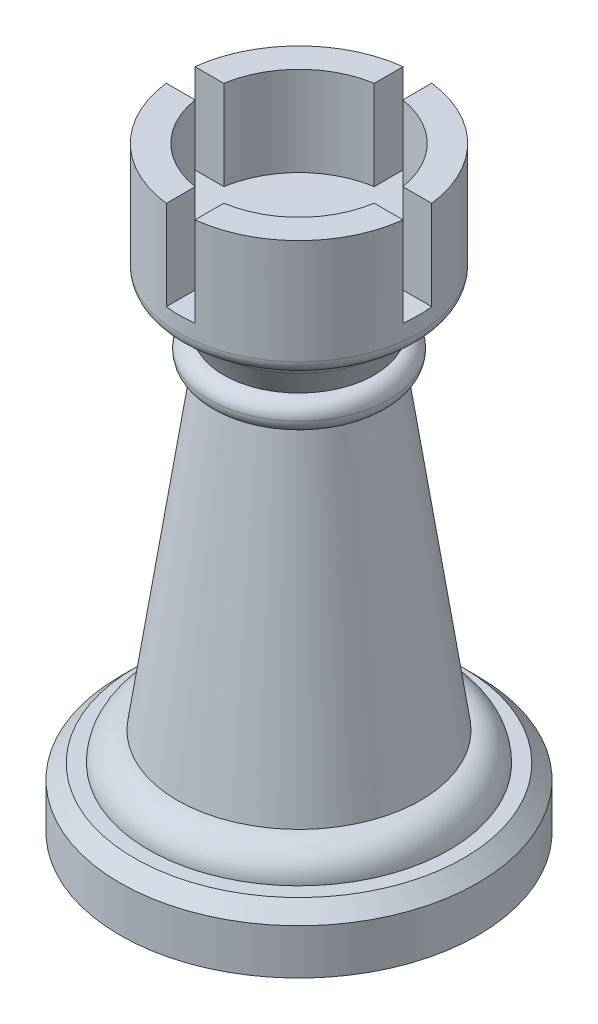
ISO-10303-21;
HEADER;
FILE_DESCRIPTION(('STEP AP214'),'2;1');
FILE_NAME('part.step','',(''),(''),'','','');
FILE_SCHEMA(('AUTOMOTIVE_DESIGN { 1 0 10303 214 1 1 1 1 }'));
ENDSEC;
DATA;
#1=APPLICATION_CONTEXT('core data for automotive mechanical design processes');
#2=APPLICATION_PROTOCOL_DEFINITION('international standard','automotive_design',2000,#1);
#3=PRODUCT_CONTEXT('',#1,'mechanical');
#4=PRODUCT('Part','Part','',(#3));
#5=PRODUCT_RELATED_PRODUCT_CATEGORY('part','',(#4));
#6=PRODUCT_DEFINITION_FORMATION('','',#4);
#7=PRODUCT_DEFINITION_CONTEXT('part definition',#1,'design');
#8=PRODUCT_DEFINITION('design','',#6,#7);
#9=PRODUCT_DEFINITION_SHAPE('','',#8);
#10=(LENGTH_UNIT() NAMED_UNIT(*) SI_UNIT(.MILLI.,.METRE.));
#11=(NAMED_UNIT(*) PLANE_ANGLE_UNIT() SI_UNIT($,.RADIAN.));
#12=(NAMED_UNIT(*) SI_UNIT($,.STERADIAN.) SOLID_ANGLE_UNIT());
#13=UNCERTAINTY_MEASURE_WITH_UNIT(LENGTH_MEASURE(1.E-05),#10,'distance_accuracy_value','');
#14=(GEOMETRIC_REPRESENTATION_CONTEXT(3) GLOBAL_UNCERTAINTY_ASSIGNED_CONTEXT((#13)) GLOBAL_UNIT_ASSIGNED_CONTEXT((#10,
#11,#12)) REPRESENTATION_CONTEXT('',''));
#15=CARTESIAN_POINT('',(0.,0.,0.));
#16=DIRECTION('',(0.,0.,1.));
#17=DIRECTION('',(1.,0.,0.));
#18=AXIS2_PLACEMENT_3D('',#15,#16,#17);
#19=CARTESIAN_POINT('',(0.,31.75,0.));
#20=DIRECTION('',(0.,-1.,0.));
#21=DIRECTION('',(0.,0.,-1.));
#22=AXIS2_PLACEMENT_3D('',#19,#20,#21);
#23=PLANE('',#22);
#24=DIRECTION('',(0.,0.,1.));
#25=VECTOR('',#24,1.);
#26=CARTESIAN_POINT('',(0.762,31.75,0.));
#27=LINE('',#26,#25);
#28=CARTESIAN_POINT('',(0.761999999999999,31.75,-6.30411421216335));
#29=VERTEX_POINT('',#28);
#30=CARTESIAN_POINT('',(0.761999999999999,31.75,-4.7654624119806));
#31=VERTEX_POINT('',#30);
#32=EDGE_CURVE('E203',#29,#31,#27,.T.);
#33=ORIENTED_EDGE('',*,*,#32,.T.);
#34=CARTESIAN_POINT('',(0.,31.75,0.));
#35=DIRECTION('',(0.,1.,0.));
#36=DIRECTION('',(0.,0.,1.));
#37=AXIS2_PLACEMENT_3D('',#34,#35,#36);
#38=CIRCLE('',#37,4.826);
#39=CARTESIAN_POINT('',(4.76546241198061,31.75,-0.761999999999984));
#40=VERTEX_POINT('',#39);
#41=EDGE_CURVE('E200',#40,#31,#38,.T.);
#42=ORIENTED_EDGE('',*,*,#41,.F.);
#43=DIRECTION('',(-1.,0.,0.));
#44=VECTOR('',#43,1.);
#45=CARTESIAN_POINT('',(0.,31.75,-0.762));
#46=LINE('',#45,#44);
#47=CARTESIAN_POINT('',(6.30411421216336,31.75,-0.761999999999979));
#48=VERTEX_POINT('',#47);
#49=EDGE_CURVE('E197',#48,#40,#46,.T.);
#50=ORIENTED_EDGE('',*,*,#49,.F.);
#51=CARTESIAN_POINT('',(0.,31.75,0.));
#52=DIRECTION('',(0.,-1.,0.));
#53=DIRECTION('',(0.,0.,-1.));
#54=AXIS2_PLACEMENT_3D('',#51,#52,#53);
#55=CIRCLE('',#54,6.35);
#56=EDGE_CURVE('E263',#29,#48,#55,.T.);
#57=ORIENTED_EDGE('',*,*,#56,.F.);
#58=EDGE_LOOP('',(#33,#42,#50,#57));
#59=FACE_BOUND('',#58,.T.);
#60=ADVANCED_FACE('F35',(#59),#23,.F.);
#61=DIRECTION('',(-1.,0.,0.));
#62=VECTOR('',#61,1.);
#63=CARTESIAN_POINT('',(0.,31.75,0.762));
#64=LINE('',#63,#62);
#65=CARTESIAN_POINT('',(6.30411421216335,31.75,0.762000000000021));
#66=VERTEX_POINT('',#65);
#67=CARTESIAN_POINT('',(4.7654624119806,31.75,0.762000000000016));
#68=VERTEX_POINT('',#67);
#69=EDGE_CURVE('E194',#66,#68,#64,.T.);
#70=ORIENTED_EDGE('',*,*,#69,.T.);
#71=CARTESIAN_POINT('',(0.,31.75,0.));
#72=DIRECTION('',(0.,1.,0.));
#73=DIRECTION('',(0.,0.,1.));
#74=AXIS2_PLACEMENT_3D('',#71,#72,#73);
#75=CIRCLE('',#74,4.826);
#76=CARTESIAN_POINT('',(0.762000000000001,31.75,4.7654624119806));
#77=VERTEX_POINT('',#76);
#78=EDGE_CURVE('E191',#77,#68,#75,.T.);
#79=ORIENTED_EDGE('',*,*,#78,.F.);
#80=DIRECTION('',(0.,0.,1.));
#81=VECTOR('',#80,1.);
#82=CARTESIAN_POINT('',(0.762,31.75,0.));
#83=LINE('',#82,#81);
#84=CARTESIAN_POINT('',(0.762000000000001,31.75,6.30411421216335));
#85=VERTEX_POINT('',#84);
#86=EDGE_CURVE('E188',#77,#85,#83,.T.);
#87=ORIENTED_EDGE('',*,*,#86,.T.);
#88=EDGE_CURVE('E266',#66,#85,#55,.T.);
#89=ORIENTED_EDGE('',*,*,#88,.F.);
#90=EDGE_LOOP('',(#70,#79,#87,#89));
#91=FACE_BOUND('',#90,.T.);
#92=ADVANCED_FACE('F303',(#91),#23,.F.);
#93=DIRECTION('',(-1.,0.,0.));
#94=VECTOR('',#93,1.);
#95=CARTESIAN_POINT('',(0.,31.75,0.762));
#96=LINE('',#95,#94);
#97=CARTESIAN_POINT('',(-4.76546241198061,31.75,0.761999999999984));
#98=VERTEX_POINT('',#97);
#99=CARTESIAN_POINT('',(-6.30411421216336,31.75,0.761999999999978));
#100=VERTEX_POINT('',#99);
#101=EDGE_CURVE('E213',#98,#100,#96,.T.);
#102=ORIENTED_EDGE('',*,*,#101,.T.);
#103=CARTESIAN_POINT('',(-0.761999999999999,31.75,6.30411421216335));
#104=VERTEX_POINT('',#103);
#105=EDGE_CURVE('E331',#104,#100,#55,.T.);
#106=ORIENTED_EDGE('',*,*,#105,.F.);
#107=DIRECTION('',(0.,0.,1.));
#108=VECTOR('',#107,1.);
#109=CARTESIAN_POINT('',(-0.762,31.75,0.));
#110=LINE('',#109,#108);
#111=CARTESIAN_POINT('',(-0.762,31.75,4.7654624119806));
#112=VERTEX_POINT('',#111);
#113=EDGE_CURVE('E186',#112,#104,#110,.T.);
#114=ORIENTED_EDGE('',*,*,#113,.F.);
#115=CARTESIAN_POINT('',(0.,31.75,0.));
#116=DIRECTION('',(0.,1.,0.));
#117=DIRECTION('',(0.,0.,1.));
#118=AXIS2_PLACEMENT_3D('',#115,#116,#117);
#119=CIRCLE('',#118,4.826);
#120=EDGE_CURVE('E184',#98,#112,#119,.T.);
#121=ORIENTED_EDGE('',*,*,#120,.F.);
#122=EDGE_LOOP('',(#102,#106,#114,#121));
#123=FACE_BOUND('',#122,.T.);
#124=ADVANCED_FACE('F310',(#123),#23,.F.);
#125=CARTESIAN_POINT('',(0.,0.,0.));
#126=DIRECTION('',(0.,-1.,0.));
#127=DIRECTION('',(0.,0.,-1.));
#128=AXIS2_PLACEMENT_3D('',#125,#126,#127);
#129=CYLINDRICAL_SURFACE('',#128,6.35);
#130=CARTESIAN_POINT('',(0.,26.162,0.));
#131=DIRECTION('',(0.,1.,0.));
#132=DIRECTION('',(0.,0.,1.));
#133=AXIS2_PLACEMENT_3D('',#130,#131,#132);
#134=CIRCLE('',#133,6.35);
#135=CARTESIAN_POINT('',(0.,26.162,6.35));
#136=VERTEX_POINT('',#135);
#137=EDGE_CURVE('E272',#136,#136,#134,.T.);
#138=ORIENTED_EDGE('',*,*,#137,.T.);
#139=EDGE_LOOP('',(#138));
#140=FACE_BOUND('',#139,.T.);
#141=ORIENTED_EDGE('',*,*,#56,.T.);
#142=DIRECTION('',(0.,1.,0.));
#143=VECTOR('',#142,1.);
#144=CARTESIAN_POINT('',(6.30411421216336,26.9875,-0.761999999999979));
#145=LINE('',#144,#143);
#146=CARTESIAN_POINT('',(6.30411421216336,26.9875,-0.761999999999979));
#147=VERTEX_POINT('',#146);
#148=EDGE_CURVE('E232',#147,#48,#145,.T.);
#149=ORIENTED_EDGE('',*,*,#148,.F.);
#150=CARTESIAN_POINT('',(0.,26.9875,0.));
#151=DIRECTION('',(0.,1.,0.));
#152=DIRECTION('',(0.,0.,1.));
#153=AXIS2_PLACEMENT_3D('',#150,#151,#152);
#154=CIRCLE('',#153,6.35);
#155=CARTESIAN_POINT('',(6.30411421216335,26.9875,0.762000000000021));
#156=VERTEX_POINT('',#155);
#157=EDGE_CURVE('E355',#156,#147,#154,.T.);
#158=ORIENTED_EDGE('',*,*,#157,.F.);
#159=DIRECTION('',(0.,1.,0.));
#160=VECTOR('',#159,1.);
#161=CARTESIAN_POINT('',(6.30411421216335,26.9875,0.762000000000021));
#162=LINE('',#161,#160);
#163=EDGE_CURVE('E234',#156,#66,#162,.T.);
#164=ORIENTED_EDGE('',*,*,#163,.T.);
#165=ORIENTED_EDGE('',*,*,#88,.T.);
#166=DIRECTION('',(0.,1.,0.));
#167=VECTOR('',#166,1.);
#168=CARTESIAN_POINT('',(0.762000000000001,26.9875,6.30411421216335));
#169=LINE('',#168,#167);
#170=CARTESIAN_POINT('',(0.762000000000001,26.9875,6.30411421216335));
#171=VERTEX_POINT('',#170);
#172=EDGE_CURVE('E241',#171,#85,#169,.T.);
#173=ORIENTED_EDGE('',*,*,#172,.F.);
#174=CARTESIAN_POINT('',(0.,26.9875,0.));
#175=DIRECTION('',(0.,1.,0.));
#176=DIRECTION('',(0.,0.,1.));
#177=AXIS2_PLACEMENT_3D('',#174,#175,#176);
#178=CIRCLE('',#177,6.35);
#179=CARTESIAN_POINT('',(-0.761999999999999,26.9875,6.30411421216335));
#180=VERTEX_POINT('',#179);
#181=EDGE_CURVE('E365',#180,#171,#178,.T.);
#182=ORIENTED_EDGE('',*,*,#181,.F.);
#183=DIRECTION('',(0.,1.,0.));
#184=VECTOR('',#183,1.);
#185=CARTESIAN_POINT('',(-0.761999999999999,26.9875,6.30411421216335));
#186=LINE('',#185,#184);
#187=EDGE_CURVE('E243',#180,#104,#186,.T.);
#188=ORIENTED_EDGE('',*,*,#187,.T.);
#189=ORIENTED_EDGE('',*,*,#105,.T.);
#190=DIRECTION('',(0.,1.,0.));
#191=VECTOR('',#190,1.);
#192=CARTESIAN_POINT('',(-6.30411421216336,26.9875,0.761999999999978));
#193=LINE('',#192,#191);
#194=CARTESIAN_POINT('',(-6.30411421216336,26.9875,0.761999999999978));
#195=VERTEX_POINT('',#194);
#196=EDGE_CURVE('E165',#195,#100,#193,.T.);
#197=ORIENTED_EDGE('',*,*,#196,.F.);
#198=CARTESIAN_POINT('',(0.,26.9875,0.));
#199=DIRECTION('',(0.,1.,0.));
#200=DIRECTION('',(0.,0.,1.));
#201=AXIS2_PLACEMENT_3D('',#198,#199,#200);
#202=CIRCLE('',#201,6.35);
#203=CARTESIAN_POINT('',(-6.30411421216335,26.9875,-0.762000000000021));
#204=VERTEX_POINT('',#203);
#205=EDGE_CURVE('E170',#204,#195,#202,.T.);
#206=ORIENTED_EDGE('',*,*,#205,.F.);
#207=DIRECTION('',(0.,1.,0.));
#208=VECTOR('',#207,1.);
#209=CARTESIAN_POINT('',(-6.30411421216335,26.9875,-0.762000000000021));
#210=LINE('',#209,#208);
#211=CARTESIAN_POINT('',(-6.30411421216335,31.75,-0.762000000000021));
#212=VERTEX_POINT('',#211);
#213=EDGE_CURVE('E154',#204,#212,#210,.T.);
#214=ORIENTED_EDGE('',*,*,#213,.T.);
#215=CARTESIAN_POINT('',(-0.762000000000001,31.75,-6.30411421216335));
#216=VERTEX_POINT('',#215);
#217=EDGE_CURVE('E262',#212,#216,#55,.T.);
#218=ORIENTED_EDGE('',*,*,#217,.T.);
#219=DIRECTION('',(0.,1.,0.));
#220=VECTOR('',#219,1.);
#221=CARTESIAN_POINT('',(-0.762000000000001,26.9875,-6.30411421216335));
#222=LINE('',#221,#220);
#223=CARTESIAN_POINT('',(-0.762000000000001,26.9875,-6.30411421216335));
#224=VERTEX_POINT('',#223);
#225=EDGE_CURVE('E223',#224,#216,#222,.T.);
#226=ORIENTED_EDGE('',*,*,#225,.F.);
#227=CARTESIAN_POINT('',(0.,26.9875,0.));
#228=DIRECTION('',(0.,1.,0.));
#229=DIRECTION('',(0.,0.,1.));
#230=AXIS2_PLACEMENT_3D('',#227,#228,#229);
#231=CIRCLE('',#230,6.35);
#232=CARTESIAN_POINT('',(0.761999999999999,26.9875,-6.30411421216335));
#233=VERTEX_POINT('',#232);
#234=EDGE_CURVE('E342',#233,#224,#231,.T.);
#235=ORIENTED_EDGE('',*,*,#234,.F.);
#236=DIRECTION('',(0.,1.,0.));
#237=VECTOR('',#236,1.);
#238=CARTESIAN_POINT('',(0.761999999999999,26.9875,-6.30411421216335));
#239=LINE('',#238,#237);
#240=EDGE_CURVE('E225',#233,#29,#239,.T.);
#241=ORIENTED_EDGE('',*,*,#240,.T.);
#242=EDGE_LOOP('',(#141,#149,#158,#164,#165,#173,#182,#188,#189,#197,#206,#214,#218,#226,#235,#241));
#243=FACE_BOUND('',#242,.T.);
#244=ADVANCED_FACE('F177',(#140,#243),#129,.T.);
#245=ORIENTED_EDGE('',*,*,#217,.F.);
#246=DIRECTION('',(-1.,0.,0.));
#247=VECTOR('',#246,1.);
#248=CARTESIAN_POINT('',(0.,31.75,-0.762));
#249=LINE('',#248,#247);
#250=CARTESIAN_POINT('',(-4.7654624119806,31.75,-0.762000000000016));
#251=VERTEX_POINT('',#250);
#252=EDGE_CURVE('E160',#251,#212,#249,.T.);
#253=ORIENTED_EDGE('',*,*,#252,.F.);
#254=CARTESIAN_POINT('',(0.,31.75,0.));
#255=DIRECTION('',(0.,1.,0.));
#256=DIRECTION('',(0.,0.,1.));
#257=AXIS2_PLACEMENT_3D('',#254,#255,#256);
#258=CIRCLE('',#257,4.826);
#259=CARTESIAN_POINT('',(-0.762000000000001,31.75,-4.7654624119806));
#260=VERTEX_POINT('',#259);
#261=EDGE_CURVE('E209',#260,#251,#258,.T.);
#262=ORIENTED_EDGE('',*,*,#261,.F.);
#263=DIRECTION('',(0.,0.,1.));
#264=VECTOR('',#263,1.);
#265=CARTESIAN_POINT('',(-0.762,31.75,0.));
#266=LINE('',#265,#264);
#267=EDGE_CURVE('E206',#216,#260,#266,.T.);
#268=ORIENTED_EDGE('',*,*,#267,.F.);
#269=EDGE_LOOP('',(#245,#253,#262,#268));
#270=FACE_BOUND('',#269,.T.);
#271=ADVANCED_FACE('F306',(#270),#23,.F.);
#272=CARTESIAN_POINT('',(0.,24.638,0.));
#273=DIRECTION('',(0.,1.,0.));
#274=DIRECTION('',(0.,0.,1.));
#275=AXIS2_PLACEMENT_3D('',#272,#273,#274);
#276=CONICAL_SURFACE('',#275,4.826,0.482814590584315);
#277=CARTESIAN_POINT('',(0.,24.50154623125,0.));
#278=DIRECTION('',(0.,-1.,0.));
#279=DIRECTION('',(0.,0.,-1.));
#280=AXIS2_PLACEMENT_3D('',#277,#278,#279);
#281=CIRCLE('',#280,4.75447181476814);
#282=CARTESIAN_POINT('',(0.,24.50154623125,-4.75447181476814));
#283=VERTEX_POINT('',#282);
#284=EDGE_CURVE('E43',#283,#283,#281,.T.);
#285=ORIENTED_EDGE('',*,*,#284,.T.);
#286=EDGE_LOOP('',(#285));
#287=FACE_BOUND('',#286,.T.);
#288=CARTESIAN_POINT('',(0.,23.0632,0.));
#289=DIRECTION('',(0.,-1.,0.));
#290=DIRECTION('',(0.,0.,-1.));
#291=AXIS2_PLACEMENT_3D('',#288,#289,#290);
#292=CIRCLE('',#291,4.0005);
#293=CARTESIAN_POINT('',(0.,23.0632,-4.0005));
#294=VERTEX_POINT('',#293);
#295=EDGE_CURVE('E259',#294,#294,#292,.T.);
#296=ORIENTED_EDGE('',*,*,#295,.F.);
#297=EDGE_LOOP('',(#296));
#298=FACE_BOUND('',#297,.T.);
#299=ADVANCED_FACE('F285',(#287,#298),#276,.T.);
#300=CARTESIAN_POINT('',(0.,0.,0.));
#301=DIRECTION('',(0.,-1.,0.));
#302=DIRECTION('',(0.,0.,-1.));
#303=AXIS2_PLACEMENT_3D('',#300,#301,#302);
#304=CYLINDRICAL_SURFACE('',#303,4.7625);
#305=CARTESIAN_POINT('',(0.,22.3002469039422,0.));
#306=DIRECTION('',(0.,-1.,0.));
#307=DIRECTION('',(0.,0.,-1.));
#308=AXIS2_PLACEMENT_3D('',#305,#306,#307);
#309=CIRCLE('',#308,4.7625);
#310=CARTESIAN_POINT('',(0.,22.3002469039422,-4.7625));
#311=VERTEX_POINT('',#310);
#312=EDGE_CURVE('E278',#311,#311,#309,.F.);
#313=ORIENTED_EDGE('',*,*,#312,.T.);
#314=EDGE_LOOP('',(#313));
#315=FACE_BOUND('',#314,.T.);
#316=CARTESIAN_POINT('',(0.,22.3012,0.));
#317=DIRECTION('',(0.,-1.,0.));
#318=DIRECTION('',(0.,0.,-1.));
#319=AXIS2_PLACEMENT_3D('',#316,#317,#318);
#320=CIRCLE('',#319,4.7625);
#321=CARTESIAN_POINT('',(0.,22.3012,-4.7625));
#322=VERTEX_POINT('',#321);
#323=EDGE_CURVE('E275',#322,#322,#320,.T.);
#324=ORIENTED_EDGE('',*,*,#323,.T.);
#325=EDGE_LOOP('',(#324));
#326=FACE_BOUND('',#325,.T.);
#327=ADVANCED_FACE('F321',(#315,#326),#304,.T.);
#328=CARTESIAN_POINT('',(0.,21.5392,0.));
#329=DIRECTION('',(0.,-1.,0.));
#330=DIRECTION('',(0.,0.,-1.));
#331=AXIS2_PLACEMENT_3D('',#328,#329,#330);
#332=CONICAL_SURFACE('',#331,4.0386,0.143796988986842);
#333=CARTESIAN_POINT('',(0.,4.699,0.));
#334=DIRECTION('',(0.,-1.,0.));
#335=DIRECTION('',(0.,0.,-1.));
#336=AXIS2_PLACEMENT_3D('',#333,#334,#335);
#337=CIRCLE('',#336,6.477);
#338=CARTESIAN_POINT('',(0.,4.699,-6.477));
#339=VERTEX_POINT('',#338);
#340=EDGE_CURVE('E253',#339,#339,#337,.T.);
#341=ORIENTED_EDGE('',*,*,#340,.F.);
#342=EDGE_LOOP('',(#341));
#343=FACE_BOUND('',#342,.T.);
#344=CARTESIAN_POINT('',(0.,21.5392,0.));
#345=DIRECTION('',(0.,-1.,0.));
#346=DIRECTION('',(0.,0.,-1.));
#347=AXIS2_PLACEMENT_3D('',#344,#345,#346);
#348=CIRCLE('',#347,4.0386);
#349=CARTESIAN_POINT('',(0.,21.5392,-4.0386));
#350=VERTEX_POINT('',#349);
#351=EDGE_CURVE('E256',#350,#350,#348,.T.);
#352=ORIENTED_EDGE('',*,*,#351,.T.);
#353=EDGE_LOOP('',(#352));
#354=FACE_BOUND('',#353,.T.);
#355=ADVANCED_FACE('F430',(#343,#354),#332,.T.);
#356=CARTESIAN_POINT('',(-8.001,3.175,0.));
#357=DIRECTION('',(0.,-1.,0.));
#358=DIRECTION('',(0.,0.,-1.));
#359=AXIS2_PLACEMENT_3D('',#356,#357,#358);
#360=PLANE('',#359);
#361=CARTESIAN_POINT('',(0.,3.175,0.));
#362=DIRECTION('',(0.,-1.,0.));
#363=DIRECTION('',(0.,0.,-1.));
#364=AXIS2_PLACEMENT_3D('',#361,#362,#363);
#365=CIRCLE('',#364,8.76299999999999);
#366=CARTESIAN_POINT('',(0.,3.175,-8.76299999999999));
#367=VERTEX_POINT('',#366);
#368=EDGE_CURVE('E269',#367,#367,#365,.F.);
#369=ORIENTED_EDGE('',*,*,#368,.T.);
#370=EDGE_LOOP('',(#369));
#371=FACE_BOUND('',#370,.T.);
#372=CARTESIAN_POINT('',(0.,3.175,0.));
#373=DIRECTION('',(0.,-1.,0.));
#374=DIRECTION('',(0.,0.,-1.));
#375=AXIS2_PLACEMENT_3D('',#372,#373,#374);
#376=CIRCLE('',#375,8.001);
#377=CARTESIAN_POINT('',(0.,3.175,-8.001));
#378=VERTEX_POINT('',#377);
#379=EDGE_CURVE('E250',#378,#378,#376,.T.);
#380=ORIENTED_EDGE('',*,*,#379,.T.);
#381=EDGE_LOOP('',(#380));
#382=FACE_BOUND('',#381,.T.);
#383=ADVANCED_FACE('F426',(#371,#382),#360,.F.);
#384=CARTESIAN_POINT('',(0.,0.,0.));
#385=DIRECTION('',(0.,-1.,0.));
#386=DIRECTION('',(0.,0.,-1.));
#387=AXIS2_PLACEMENT_3D('',#384,#385,#386);
#388=CYLINDRICAL_SURFACE('',#387,9.525);
#389=CARTESIAN_POINT('',(0.,2.41299999999999,0.));
#390=DIRECTION('',(0.,-1.,0.));
#391=DIRECTION('',(0.,0.,-1.));
#392=AXIS2_PLACEMENT_3D('',#389,#390,#391);
#393=CIRCLE('',#392,9.525);
#394=CARTESIAN_POINT('',(0.,2.41299999999999,-9.525));
#395=VERTEX_POINT('',#394);
#396=EDGE_CURVE('E265',#395,#395,#393,.T.);
#397=ORIENTED_EDGE('',*,*,#396,.T.);
#398=EDGE_LOOP('',(#397));
#399=FACE_BOUND('',#398,.T.);
#400=CARTESIAN_POINT('',(0.,0.,0.));
#401=DIRECTION('',(0.,-1.,0.));
#402=DIRECTION('',(0.,0.,-1.));
#403=AXIS2_PLACEMENT_3D('',#400,#401,#402);
#404=CIRCLE('',#403,9.525);
#405=CARTESIAN_POINT('',(0.,0.,-9.525));
#406=VERTEX_POINT('',#405);
#407=EDGE_CURVE('E247',#406,#406,#404,.T.);
#408=ORIENTED_EDGE('',*,*,#407,.F.);
#409=EDGE_LOOP('',(#408));
#410=FACE_BOUND('',#409,.T.);
#411=ADVANCED_FACE('F422',(#399,#410),#388,.T.);
#412=CARTESIAN_POINT('',(0.,0.,0.));
#413=DIRECTION('',(0.,1.,0.));
#414=DIRECTION('',(0.,0.,1.));
#415=AXIS2_PLACEMENT_3D('',#412,#413,#414);
#416=PLANE('',#415);
#417=ORIENTED_EDGE('',*,*,#407,.T.);
#418=EDGE_LOOP('',(#417));
#419=FACE_BOUND('',#418,.T.);
#420=ADVANCED_FACE('F418',(#419),#416,.F.);
#421=CARTESIAN_POINT('',(0.,2.41299999999999,0.));
#422=DIRECTION('',(0.,-1.,0.));
#423=DIRECTION('',(0.,0.,-1.));
#424=AXIS2_PLACEMENT_3D('',#421,#422,#423);
#425=CONICAL_SURFACE('',#424,9.525,0.785398163397451);
#426=ORIENTED_EDGE('',*,*,#368,.F.);
#427=EDGE_LOOP('',(#426));
#428=FACE_BOUND('',#427,.T.);
#429=ORIENTED_EDGE('',*,*,#396,.F.);
#430=EDGE_LOOP('',(#429));
#431=FACE_BOUND('',#430,.T.);
#432=ADVANCED_FACE('F421',(#428,#431),#425,.T.);
#433=CARTESIAN_POINT('',(0.,3.175,0.));
#434=DIRECTION('',(0.,-1.,0.));
#435=DIRECTION('',(0.,0.,-1.));
#436=AXIS2_PLACEMENT_3D('',#433,#434,#435);
#437=TOROIDAL_SURFACE('',#436,6.477,1.524);
#438=ORIENTED_EDGE('',*,*,#340,.T.);
#439=EDGE_LOOP('',(#438));
#440=FACE_BOUND('',#439,.T.);
#441=ORIENTED_EDGE('',*,*,#379,.F.);
#442=EDGE_LOOP('',(#441));
#443=FACE_BOUND('',#442,.T.);
#444=ADVANCED_FACE('F460',(#440,#443),#437,.T.);
#445=CARTESIAN_POINT('',(0.,26.162,0.));
#446=DIRECTION('',(0.,1.,0.));
#447=DIRECTION('',(0.,0.,1.));
#448=AXIS2_PLACEMENT_3D('',#445,#446,#447);
#449=TOROIDAL_SURFACE('',#448,5.588,0.762);
#450=ORIENTED_EDGE('',*,*,#137,.F.);
#451=EDGE_LOOP('',(#450));
#452=FACE_BOUND('',#451,.T.);
#453=CARTESIAN_POINT('',(0.,25.4,0.));
#454=DIRECTION('',(0.,1.,0.));
#455=DIRECTION('',(0.,0.,1.));
#456=AXIS2_PLACEMENT_3D('',#453,#454,#455);
#457=CIRCLE('',#456,5.588);
#458=CARTESIAN_POINT('',(0.,25.4,5.588));
#459=VERTEX_POINT('',#458);
#460=EDGE_CURVE('E218',#459,#459,#457,.F.);
#461=ORIENTED_EDGE('',*,*,#460,.F.);
#462=EDGE_LOOP('',(#461));
#463=FACE_BOUND('',#462,.T.);
#464=ADVANCED_FACE('F455',(#452,#463),#449,.T.);
#465=CARTESIAN_POINT('',(0.,24.638,0.));
#466=DIRECTION('',(0.,1.,0.));
#467=DIRECTION('',(0.,0.,1.));
#468=AXIS2_PLACEMENT_3D('',#465,#466,#467);
#469=TOROIDAL_SURFACE('',#468,5.588,0.762);
#470=CARTESIAN_POINT('',(0.,24.7466614603676,0.));
#471=DIRECTION('',(0.,-1.,0.));
#472=DIRECTION('',(0.,0.,-1.));
#473=AXIS2_PLACEMENT_3D('',#470,#471,#472);
#474=CIRCLE('',#473,4.8337873727981);
#475=CARTESIAN_POINT('',(0.,24.7466614603676,-4.8337873727981));
#476=VERTEX_POINT('',#475);
#477=EDGE_CURVE('E11',#476,#476,#474,.F.);
#478=ORIENTED_EDGE('',*,*,#477,.T.);
#479=EDGE_LOOP('',(#478));
#480=FACE_BOUND('',#479,.T.);
#481=ORIENTED_EDGE('',*,*,#460,.T.);
#482=EDGE_LOOP('',(#481));
#483=FACE_BOUND('',#482,.T.);
#484=ADVANCED_FACE('F448',(#480,#483),#469,.F.);
#485=CARTESIAN_POINT('',(0.,22.3002469039422,0.));
#486=DIRECTION('',(0.,-1.,0.));
#487=DIRECTION('',(0.,0.,-1.));
#488=AXIS2_PLACEMENT_3D('',#485,#486,#487);
#489=TOROIDAL_SURFACE('',#488,4.0005,0.762);
#490=ORIENTED_EDGE('',*,*,#312,.F.);
#491=EDGE_LOOP('',(#490));
#492=FACE_BOUND('',#491,.T.);
#493=ORIENTED_EDGE('',*,*,#351,.F.);
#494=EDGE_LOOP('',(#493));
#495=FACE_BOUND('',#494,.T.);
#496=ADVANCED_FACE('F299',(#492,#495),#489,.T.);
#497=CARTESIAN_POINT('',(0.,22.3012,0.));
#498=DIRECTION('',(0.,-1.,0.));
#499=DIRECTION('',(0.,0.,-1.));
#500=AXIS2_PLACEMENT_3D('',#497,#498,#499);
#501=TOROIDAL_SURFACE('',#500,4.0005,0.762);
#502=ORIENTED_EDGE('',*,*,#295,.T.);
#503=EDGE_LOOP('',(#502));
#504=FACE_BOUND('',#503,.T.);
#505=ORIENTED_EDGE('',*,*,#323,.F.);
#506=EDGE_LOOP('',(#505));
#507=FACE_BOUND('',#506,.T.);
#508=ADVANCED_FACE('F290',(#504,#507),#501,.T.);
#509=CARTESIAN_POINT('',(0.,24.8553229207353,0.));
#510=DIRECTION('',(0.,1.,0.));
#511=DIRECTION('',(0.,0.,1.));
#512=AXIS2_PLACEMENT_3D('',#509,#510,#511);
#513=TOROIDAL_SURFACE('',#512,4.07957474559622,0.762);
#514=ORIENTED_EDGE('',*,*,#477,.F.);
#515=EDGE_LOOP('',(#514));
#516=FACE_BOUND('',#515,.T.);
#517=ORIENTED_EDGE('',*,*,#284,.F.);
#518=EDGE_LOOP('',(#517));
#519=FACE_BOUND('',#518,.T.);
#520=ADVANCED_FACE('F37',(#516,#519),#513,.T.);
#521=CARTESIAN_POINT('',(0.,26.9875,0.));
#522=DIRECTION('',(0.,1.,0.));
#523=DIRECTION('',(0.,0.,1.));
#524=AXIS2_PLACEMENT_3D('',#521,#522,#523);
#525=CYLINDRICAL_SURFACE('',#524,4.826);
#526=ORIENTED_EDGE('',*,*,#120,.T.);
#527=DIRECTION('',(0.,1.,0.));
#528=VECTOR('',#527,1.);
#529=CARTESIAN_POINT('',(-0.762,26.9875,4.7654624119806));
#530=LINE('',#529,#528);
#531=CARTESIAN_POINT('',(-0.762,26.9875,4.7654624119806));
#532=VERTEX_POINT('',#531);
#533=EDGE_CURVE('E117',#532,#112,#530,.T.);
#534=ORIENTED_EDGE('',*,*,#533,.F.);
#535=CARTESIAN_POINT('',(0.,26.9875,0.));
#536=DIRECTION('',(0.,1.,0.));
#537=DIRECTION('',(0.,0.,1.));
#538=AXIS2_PLACEMENT_3D('',#535,#536,#537);
#539=CIRCLE('',#538,4.826);
#540=CARTESIAN_POINT('',(-4.76546241198061,26.9875,0.761999999999984));
#541=VERTEX_POINT('',#540);
#542=EDGE_CURVE('E216',#541,#532,#539,.T.);
#543=ORIENTED_EDGE('',*,*,#542,.F.);
#544=DIRECTION('',(0.,1.,0.));
#545=VECTOR('',#544,1.);
#546=CARTESIAN_POINT('',(-4.76546241198061,26.9875,0.761999999999984));
#547=LINE('',#546,#545);
#548=EDGE_CURVE('E59',#541,#98,#547,.T.);
#549=ORIENTED_EDGE('',*,*,#548,.T.);
#550=EDGE_LOOP('',(#526,#534,#543,#549));
#551=FACE_BOUND('',#550,.T.);
#552=ADVANCED_FACE('F289',(#551),#525,.F.);
#553=CARTESIAN_POINT('',(0.,26.9875,0.762));
#554=DIRECTION('',(0.,0.,-1.));
#555=DIRECTION('',(-1.,0.,0.));
#556=AXIS2_PLACEMENT_3D('',#553,#554,#555);
#557=PLANE('',#556);
#558=ORIENTED_EDGE('',*,*,#101,.F.);
#559=ORIENTED_EDGE('',*,*,#548,.F.);
#560=DIRECTION('',(-1.,0.,0.));
#561=VECTOR('',#560,1.);
#562=CARTESIAN_POINT('',(0.,26.9875,0.762));
#563=LINE('',#562,#561);
#564=EDGE_CURVE('E179',#541,#195,#563,.T.);
#565=ORIENTED_EDGE('',*,*,#564,.T.);
#566=ORIENTED_EDGE('',*,*,#196,.T.);
#567=EDGE_LOOP('',(#558,#559,#565,#566));
#568=FACE_BOUND('',#567,.T.);
#569=ADVANCED_FACE('F297',(#568),#557,.T.);
#570=CARTESIAN_POINT('',(0.,26.9875,-0.762));
#571=DIRECTION('',(0.,0.,-1.));
#572=DIRECTION('',(-1.,0.,0.));
#573=AXIS2_PLACEMENT_3D('',#570,#571,#572);
#574=PLANE('',#573);
#575=ORIENTED_EDGE('',*,*,#252,.T.);
#576=ORIENTED_EDGE('',*,*,#213,.F.);
#577=DIRECTION('',(-1.,0.,0.));
#578=VECTOR('',#577,1.);
#579=CARTESIAN_POINT('',(0.,26.9875,-0.762));
#580=LINE('',#579,#578);
#581=CARTESIAN_POINT('',(-4.7654624119806,26.9875,-0.762000000000016));
#582=VERTEX_POINT('',#581);
#583=EDGE_CURVE('E157',#582,#204,#580,.T.);
#584=ORIENTED_EDGE('',*,*,#583,.F.);
#585=DIRECTION('',(0.,1.,0.));
#586=VECTOR('',#585,1.);
#587=CARTESIAN_POINT('',(-4.7654624119806,26.9875,-0.762000000000016));
#588=LINE('',#587,#586);
#589=EDGE_CURVE('E166',#582,#251,#588,.T.);
#590=ORIENTED_EDGE('',*,*,#589,.T.);
#591=EDGE_LOOP('',(#575,#576,#584,#590));
#592=FACE_BOUND('',#591,.T.);
#593=ADVANCED_FACE('F156',(#592),#574,.F.);
#594=CARTESIAN_POINT('',(0.,26.9875,0.));
#595=DIRECTION('',(0.,1.,0.));
#596=DIRECTION('',(0.,0.,1.));
#597=AXIS2_PLACEMENT_3D('',#594,#595,#596);
#598=CYLINDRICAL_SURFACE('',#597,4.826);
#599=ORIENTED_EDGE('',*,*,#261,.T.);
#600=ORIENTED_EDGE('',*,*,#589,.F.);
#601=CARTESIAN_POINT('',(0.,26.9875,0.));
#602=DIRECTION('',(0.,1.,0.));
#603=DIRECTION('',(0.,0.,1.));
#604=AXIS2_PLACEMENT_3D('',#601,#602,#603);
#605=CIRCLE('',#604,4.826);
#606=CARTESIAN_POINT('',(-0.762000000000001,26.9875,-4.7654624119806));
#607=VERTEX_POINT('',#606);
#608=EDGE_CURVE('E174',#607,#582,#605,.T.);
#609=ORIENTED_EDGE('',*,*,#608,.F.);
#610=DIRECTION('',(0.,1.,0.));
#611=VECTOR('',#610,1.);
#612=CARTESIAN_POINT('',(-0.762000000000001,26.9875,-4.7654624119806));
#613=LINE('',#612,#611);
#614=EDGE_CURVE('E221',#607,#260,#613,.T.);
#615=ORIENTED_EDGE('',*,*,#614,.T.);
#616=EDGE_LOOP('',(#599,#600,#609,#615));
#617=FACE_BOUND('',#616,.T.);
#618=ADVANCED_FACE('F403',(#617),#598,.F.);
#619=CARTESIAN_POINT('',(-0.762,26.9875,0.));
#620=DIRECTION('',(-1.,0.,0.));
#621=DIRECTION('',(0.,0.,1.));
#622=AXIS2_PLACEMENT_3D('',#619,#620,#621);
#623=PLANE('',#622);
#624=ORIENTED_EDGE('',*,*,#267,.T.);
#625=ORIENTED_EDGE('',*,*,#614,.F.);
#626=DIRECTION('',(0.,0.,1.));
#627=VECTOR('',#626,1.);
#628=CARTESIAN_POINT('',(-0.762,26.9875,0.));
#629=LINE('',#628,#627);
#630=EDGE_CURVE('E340',#224,#607,#629,.T.);
#631=ORIENTED_EDGE('',*,*,#630,.F.);
#632=ORIENTED_EDGE('',*,*,#225,.T.);
#633=EDGE_LOOP('',(#624,#625,#631,#632));
#634=FACE_BOUND('',#633,.T.);
#635=ADVANCED_FACE('F339',(#634),#623,.F.);
#636=CARTESIAN_POINT('',(0.762,26.9875,0.));
#637=DIRECTION('',(-1.,0.,0.));
#638=DIRECTION('',(0.,0.,1.));
#639=AXIS2_PLACEMENT_3D('',#636,#637,#638);
#640=PLANE('',#639);
#641=ORIENTED_EDGE('',*,*,#32,.F.);
#642=ORIENTED_EDGE('',*,*,#240,.F.);
#643=DIRECTION('',(0.,0.,1.));
#644=VECTOR('',#643,1.);
#645=CARTESIAN_POINT('',(0.762,26.9875,0.));
#646=LINE('',#645,#644);
#647=CARTESIAN_POINT('',(0.761999999999999,26.9875,-4.7654624119806));
#648=VERTEX_POINT('',#647);
#649=EDGE_CURVE('E346',#233,#648,#646,.T.);
#650=ORIENTED_EDGE('',*,*,#649,.T.);
#651=DIRECTION('',(0.,1.,0.));
#652=VECTOR('',#651,1.);
#653=CARTESIAN_POINT('',(0.761999999999999,26.9875,-4.7654624119806));
#654=LINE('',#653,#652);
#655=EDGE_CURVE('E228',#648,#31,#654,.T.);
#656=ORIENTED_EDGE('',*,*,#655,.T.);
#657=EDGE_LOOP('',(#641,#642,#650,#656));
#658=FACE_BOUND('',#657,.T.);
#659=ADVANCED_FACE('F395',(#658),#640,.T.);
#660=CARTESIAN_POINT('',(0.,26.9875,0.));
#661=DIRECTION('',(0.,1.,0.));
#662=DIRECTION('',(0.,0.,1.));
#663=AXIS2_PLACEMENT_3D('',#660,#661,#662);
#664=CYLINDRICAL_SURFACE('',#663,4.826);
#665=ORIENTED_EDGE('',*,*,#41,.T.);
#666=ORIENTED_EDGE('',*,*,#655,.F.);
#667=CARTESIAN_POINT('',(0.,26.9875,0.));
#668=DIRECTION('',(0.,1.,0.));
#669=DIRECTION('',(0.,0.,1.));
#670=AXIS2_PLACEMENT_3D('',#667,#668,#669);
#671=CIRCLE('',#670,4.826);
#672=CARTESIAN_POINT('',(4.76546241198061,26.9875,-0.761999999999984));
#673=VERTEX_POINT('',#672);
#674=EDGE_CURVE('E348',#673,#648,#671,.T.);
#675=ORIENTED_EDGE('',*,*,#674,.F.);
#676=DIRECTION('',(0.,1.,0.));
#677=VECTOR('',#676,1.);
#678=CARTESIAN_POINT('',(4.76546241198061,26.9875,-0.761999999999984));
#679=LINE('',#678,#677);
#680=EDGE_CURVE('E230',#673,#40,#679,.T.);
#681=ORIENTED_EDGE('',*,*,#680,.T.);
#682=EDGE_LOOP('',(#665,#666,#675,#681));
#683=FACE_BOUND('',#682,.T.);
#684=ADVANCED_FACE('F392',(#683),#664,.F.);
#685=CARTESIAN_POINT('',(0.,26.9875,-0.762));
#686=DIRECTION('',(0.,0.,-1.));
#687=DIRECTION('',(-1.,0.,0.));
#688=AXIS2_PLACEMENT_3D('',#685,#686,#687);
#689=PLANE('',#688);
#690=ORIENTED_EDGE('',*,*,#49,.T.);
#691=ORIENTED_EDGE('',*,*,#680,.F.);
#692=DIRECTION('',(-1.,0.,0.));
#693=VECTOR('',#692,1.);
#694=CARTESIAN_POINT('',(0.,26.9875,-0.762));
#695=LINE('',#694,#693);
#696=EDGE_CURVE('E352',#147,#673,#695,.T.);
#697=ORIENTED_EDGE('',*,*,#696,.F.);
#698=ORIENTED_EDGE('',*,*,#148,.T.);
#699=EDGE_LOOP('',(#690,#691,#697,#698));
#700=FACE_BOUND('',#699,.T.);
#701=ADVANCED_FACE('F388',(#700),#689,.F.);
#702=CARTESIAN_POINT('',(0.,26.9875,0.762));
#703=DIRECTION('',(0.,0.,-1.));
#704=DIRECTION('',(-1.,0.,0.));
#705=AXIS2_PLACEMENT_3D('',#702,#703,#704);
#706=PLANE('',#705);
#707=ORIENTED_EDGE('',*,*,#69,.F.);
#708=ORIENTED_EDGE('',*,*,#163,.F.);
#709=DIRECTION('',(-1.,0.,0.));
#710=VECTOR('',#709,1.);
#711=CARTESIAN_POINT('',(0.,26.9875,0.762));
#712=LINE('',#711,#710);
#713=CARTESIAN_POINT('',(4.7654624119806,26.9875,0.762000000000016));
#714=VERTEX_POINT('',#713);
#715=EDGE_CURVE('E358',#156,#714,#712,.T.);
#716=ORIENTED_EDGE('',*,*,#715,.T.);
#717=DIRECTION('',(0.,1.,0.));
#718=VECTOR('',#717,1.);
#719=CARTESIAN_POINT('',(4.7654624119806,26.9875,0.762000000000016));
#720=LINE('',#719,#718);
#721=EDGE_CURVE('E237',#714,#68,#720,.T.);
#722=ORIENTED_EDGE('',*,*,#721,.T.);
#723=EDGE_LOOP('',(#707,#708,#716,#722));
#724=FACE_BOUND('',#723,.T.);
#725=ADVANCED_FACE('F381',(#724),#706,.T.);
#726=CARTESIAN_POINT('',(0.,26.9875,0.));
#727=DIRECTION('',(0.,1.,0.));
#728=DIRECTION('',(0.,0.,1.));
#729=AXIS2_PLACEMENT_3D('',#726,#727,#728);
#730=CYLINDRICAL_SURFACE('',#729,4.826);
#731=ORIENTED_EDGE('',*,*,#78,.T.);
#732=ORIENTED_EDGE('',*,*,#721,.F.);
#733=CARTESIAN_POINT('',(0.,26.9875,0.));
#734=DIRECTION('',(0.,1.,0.));
#735=DIRECTION('',(0.,0.,1.));
#736=AXIS2_PLACEMENT_3D('',#733,#734,#735);
#737=CIRCLE('',#736,4.826);
#738=CARTESIAN_POINT('',(0.762000000000001,26.9875,4.7654624119806));
#739=VERTEX_POINT('',#738);
#740=EDGE_CURVE('E360',#739,#714,#737,.T.);
#741=ORIENTED_EDGE('',*,*,#740,.F.);
#742=DIRECTION('',(0.,1.,0.));
#743=VECTOR('',#742,1.);
#744=CARTESIAN_POINT('',(0.762000000000001,26.9875,4.7654624119806));
#745=LINE('',#744,#743);
#746=EDGE_CURVE('E239',#739,#77,#745,.T.);
#747=ORIENTED_EDGE('',*,*,#746,.T.);
#748=EDGE_LOOP('',(#731,#732,#741,#747));
#749=FACE_BOUND('',#748,.T.);
#750=ADVANCED_FACE('F377',(#749),#730,.F.);
#751=CARTESIAN_POINT('',(0.762,26.9875,0.));
#752=DIRECTION('',(-1.,0.,0.));
#753=DIRECTION('',(0.,0.,1.));
#754=AXIS2_PLACEMENT_3D('',#751,#752,#753);
#755=PLANE('',#754);
#756=ORIENTED_EDGE('',*,*,#86,.F.);
#757=ORIENTED_EDGE('',*,*,#746,.F.);
#758=DIRECTION('',(0.,0.,1.));
#759=VECTOR('',#758,1.);
#760=CARTESIAN_POINT('',(0.762,26.9875,0.));
#761=LINE('',#760,#759);
#762=EDGE_CURVE('E363',#739,#171,#761,.T.);
#763=ORIENTED_EDGE('',*,*,#762,.T.);
#764=ORIENTED_EDGE('',*,*,#172,.T.);
#765=EDGE_LOOP('',(#756,#757,#763,#764));
#766=FACE_BOUND('',#765,.T.);
#767=ADVANCED_FACE('F413',(#766),#755,.T.);
#768=CARTESIAN_POINT('',(-0.762,26.9875,0.));
#769=DIRECTION('',(-1.,0.,0.));
#770=DIRECTION('',(0.,0.,1.));
#771=AXIS2_PLACEMENT_3D('',#768,#769,#770);
#772=PLANE('',#771);
#773=ORIENTED_EDGE('',*,*,#113,.T.);
#774=ORIENTED_EDGE('',*,*,#187,.F.);
#775=DIRECTION('',(0.,0.,1.));
#776=VECTOR('',#775,1.);
#777=CARTESIAN_POINT('',(-0.762,26.9875,0.));
#778=LINE('',#777,#776);
#779=EDGE_CURVE('E50',#532,#180,#778,.T.);
#780=ORIENTED_EDGE('',*,*,#779,.F.);
#781=ORIENTED_EDGE('',*,*,#533,.T.);
#782=EDGE_LOOP('',(#773,#774,#780,#781));
#783=FACE_BOUND('',#782,.T.);
#784=ADVANCED_FACE('F369',(#783),#772,.F.);
#785=CARTESIAN_POINT('',(0.,26.9875,0.));
#786=DIRECTION('',(0.,1.,0.));
#787=DIRECTION('',(0.,0.,1.));
#788=AXIS2_PLACEMENT_3D('',#785,#786,#787);
#789=PLANE('',#788);
#790=ORIENTED_EDGE('',*,*,#542,.T.);
#791=ORIENTED_EDGE('',*,*,#779,.T.);
#792=ORIENTED_EDGE('',*,*,#181,.T.);
#793=ORIENTED_EDGE('',*,*,#762,.F.);
#794=ORIENTED_EDGE('',*,*,#740,.T.);
#795=ORIENTED_EDGE('',*,*,#715,.F.);
#796=ORIENTED_EDGE('',*,*,#157,.T.);
#797=ORIENTED_EDGE('',*,*,#696,.T.);
#798=ORIENTED_EDGE('',*,*,#674,.T.);
#799=ORIENTED_EDGE('',*,*,#649,.F.);
#800=ORIENTED_EDGE('',*,*,#234,.T.);
#801=ORIENTED_EDGE('',*,*,#630,.T.);
#802=ORIENTED_EDGE('',*,*,#608,.T.);
#803=ORIENTED_EDGE('',*,*,#583,.T.);
#804=ORIENTED_EDGE('',*,*,#205,.T.);
#805=ORIENTED_EDGE('',*,*,#564,.F.);
#806=EDGE_LOOP('',(#790,#791,#792,#793,#794,#795,#796,#797,#798,#799,#800,#801,#802,#803,#804,#805));
#807=FACE_BOUND('',#806,.T.);
#808=ADVANCED_FACE('F169',(#807),#789,.T.);
#809=CLOSED_SHELL('',(#60,#92,#124,#244,#271,#299,#327,#355,#383,#411,#420,#432,#444,#464,#484,
#496,#508,#520,#552,#569,#593,#618,#635,#659,#684,#701,#725,#750,#767,#784,#808));
#810=MANIFOLD_SOLID_BREP('B2',#809);
#811=ADVANCED_BREP_SHAPE_REPRESENTATION('',(#18,#810),#14);
#812=SHAPE_DEFINITION_REPRESENTATION(#9,#811);
ENDSEC;
END-ISO-10303-21;
